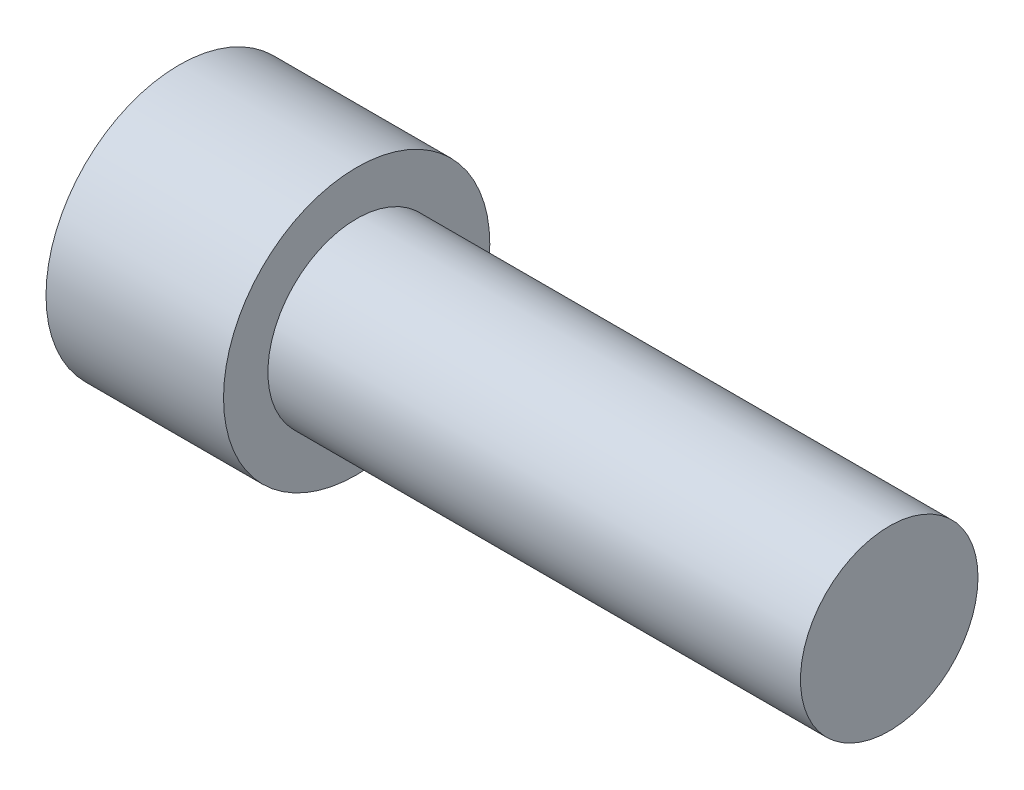
ISO-10303-21;
HEADER;
FILE_DESCRIPTION(('STEP AP214'),'2;1');
FILE_NAME('part.step','',(''),(''),'','','');
FILE_SCHEMA(('AUTOMOTIVE_DESIGN { 1 0 10303 214 1 1 1 1 }'));
ENDSEC;
DATA;
#1=APPLICATION_CONTEXT('core data for automotive mechanical design processes');
#2=APPLICATION_PROTOCOL_DEFINITION('international standard','automotive_design',2000,#1);
#3=PRODUCT_CONTEXT('',#1,'mechanical');
#4=PRODUCT('Part','Part','',(#3));
#5=PRODUCT_RELATED_PRODUCT_CATEGORY('part','',(#4));
#6=PRODUCT_DEFINITION_FORMATION('','',#4);
#7=PRODUCT_DEFINITION_CONTEXT('part definition',#1,'design');
#8=PRODUCT_DEFINITION('design','',#6,#7);
#9=PRODUCT_DEFINITION_SHAPE('','',#8);
#10=(LENGTH_UNIT() NAMED_UNIT(*) SI_UNIT(.MILLI.,.METRE.));
#11=(NAMED_UNIT(*) PLANE_ANGLE_UNIT() SI_UNIT($,.RADIAN.));
#12=(NAMED_UNIT(*) SI_UNIT($,.STERADIAN.) SOLID_ANGLE_UNIT());
#13=UNCERTAINTY_MEASURE_WITH_UNIT(LENGTH_MEASURE(1.E-05),#10,'distance_accuracy_value','');
#14=(GEOMETRIC_REPRESENTATION_CONTEXT(3) GLOBAL_UNCERTAINTY_ASSIGNED_CONTEXT((#13)) GLOBAL_UNIT_ASSIGNED_CONTEXT((#10,
#11,#12)) REPRESENTATION_CONTEXT('',''));
#15=CARTESIAN_POINT('',(0.,0.,0.));
#16=DIRECTION('',(0.,0.,1.));
#17=DIRECTION('',(1.,0.,0.));
#18=AXIS2_PLACEMENT_3D('',#15,#16,#17);
#19=CARTESIAN_POINT('',(19.0500000000004,0.,2.84494650060196E-13));
#20=DIRECTION('',(-1.00000000000001,0.,0.));
#21=DIRECTION('',(0.,0.,0.999999999999999));
#22=AXIS2_PLACEMENT_3D('',#19,#20,#21);
#23=CYLINDRICAL_SURFACE('',#22,3.175);
#24=CARTESIAN_POINT('',(19.0500000000004,0.,2.84494650060196E-13));
#25=DIRECTION('',(1.00000000000001,0.,0.));
#26=DIRECTION('',(0.,0.,-0.999999999999999));
#27=AXIS2_PLACEMENT_3D('',#24,#25,#26);
#28=CIRCLE('',#27,3.175);
#29=CARTESIAN_POINT('',(19.0500000000004,0.,-3.17499999999971));
#30=VERTEX_POINT('',#29);
#31=EDGE_CURVE('E11',#30,#30,#28,.T.);
#32=ORIENTED_EDGE('',*,*,#31,.F.);
#33=EDGE_LOOP('',(#32));
#34=FACE_BOUND('',#33,.T.);
#35=CARTESIAN_POINT('',(0.,0.,0.));
#36=DIRECTION('',(1.00000000000001,0.,0.));
#37=DIRECTION('',(0.,0.,-0.999999999999999));
#38=AXIS2_PLACEMENT_3D('',#35,#36,#37);
#39=CIRCLE('',#38,3.175);
#40=CARTESIAN_POINT('',(0.,1.02694885863559E-13,-3.175));
#41=VERTEX_POINT('',#40);
#42=EDGE_CURVE('E37',#41,#41,#39,.T.);
#43=ORIENTED_EDGE('',*,*,#42,.T.);
#44=EDGE_LOOP('',(#43));
#45=FACE_BOUND('',#44,.T.);
#46=ADVANCED_FACE('F34',(#34,#45),#23,.T.);
#47=CARTESIAN_POINT('',(19.0500000000004,0.,2.84494650060196E-13));
#48=DIRECTION('',(1.00000000000001,0.,0.));
#49=DIRECTION('',(0.,0.,-0.999999999999999));
#50=AXIS2_PLACEMENT_3D('',#47,#48,#49);
#51=PLANE('',#50);
#52=ORIENTED_EDGE('',*,*,#31,.T.);
#53=EDGE_LOOP('',(#52));
#54=FACE_BOUND('',#53,.T.);
#55=ADVANCED_FACE('F166',(#54),#51,.T.);
#56=CARTESIAN_POINT('',(-6.35000000000024,0.,0.));
#57=DIRECTION('',(1.00000000000001,0.,0.));
#58=DIRECTION('',(0.,0.,-0.999999999999999));
#59=AXIS2_PLACEMENT_3D('',#56,#57,#58);
#60=CYLINDRICAL_SURFACE('',#59,4.7625);
#61=CARTESIAN_POINT('',(-6.35000000000024,0.,0.));
#62=DIRECTION('',(-1.00000000000001,0.,0.));
#63=DIRECTION('',(0.,0.,0.999999999999999));
#64=AXIS2_PLACEMENT_3D('',#61,#62,#63);
#65=CIRCLE('',#64,4.7625);
#66=CARTESIAN_POINT('',(-6.3500000000002,-2.23431267834411E-13,4.76250000000002));
#67=VERTEX_POINT('',#66);
#68=EDGE_CURVE('E141',#67,#67,#65,.T.);
#69=ORIENTED_EDGE('',*,*,#68,.F.);
#70=EDGE_LOOP('',(#69));
#71=FACE_BOUND('',#70,.T.);
#72=CARTESIAN_POINT('',(0.,0.,0.));
#73=DIRECTION('',(-1.00000000000001,0.,0.));
#74=DIRECTION('',(0.,0.,0.999999999999999));
#75=AXIS2_PLACEMENT_3D('',#72,#73,#74);
#76=CIRCLE('',#75,4.7625);
#77=CARTESIAN_POINT('',(0.,-1.54042328795339E-13,4.76249999999999));
#78=VERTEX_POINT('',#77);
#79=EDGE_CURVE('E135',#78,#78,#76,.T.);
#80=ORIENTED_EDGE('',*,*,#79,.T.);
#81=EDGE_LOOP('',(#80));
#82=FACE_BOUND('',#81,.T.);
#83=ADVANCED_FACE('F147',(#71,#82),#60,.T.);
#84=CARTESIAN_POINT('',(-6.35000000000024,0.,0.));
#85=DIRECTION('',(-1.00000000000001,0.,0.));
#86=DIRECTION('',(0.,0.,0.999999999999999));
#87=AXIS2_PLACEMENT_3D('',#84,#85,#86);
#88=PLANE('',#87);
#89=DIRECTION('',(0.,0.499999999999968,0.866025403784426));
#90=VECTOR('',#89,1.);
#91=CARTESIAN_POINT('',(-6.35000000000002,-2.74963065701556,0.));
#92=LINE('',#91,#90);
#93=CARTESIAN_POINT('',(-6.35000000000002,-2.74963065701556,0.));
#94=VERTEX_POINT('',#93);
#95=CARTESIAN_POINT('',(-6.34999999999994,-1.37481532850786,2.38125000000001));
#96=VERTEX_POINT('',#95);
#97=EDGE_CURVE('E48',#94,#96,#92,.T.);
#98=ORIENTED_EDGE('',*,*,#97,.F.);
#99=DIRECTION('',(0.,-0.500000000000021,0.866025403784447));
#100=VECTOR('',#99,1.);
#101=CARTESIAN_POINT('',(-6.35000000000002,-1.37481532850781,-2.38125));
#102=LINE('',#101,#100);
#103=CARTESIAN_POINT('',(-6.35000000000002,-1.37481532850781,-2.38125));
#104=VERTEX_POINT('',#103);
#105=EDGE_CURVE('E131',#104,#94,#102,.T.);
#106=ORIENTED_EDGE('',*,*,#105,.F.);
#107=DIRECTION('',(0.,-0.999999999999991,0.));
#108=VECTOR('',#107,1.);
#109=CARTESIAN_POINT('',(-6.35000000000022,1.3748153285078,-2.38125000000008));
#110=LINE('',#109,#108);
#111=CARTESIAN_POINT('',(-6.35000000000022,1.3748153285078,-2.38125000000008));
#112=VERTEX_POINT('',#111);
#113=EDGE_CURVE('E129',#112,#104,#110,.T.);
#114=ORIENTED_EDGE('',*,*,#113,.F.);
#115=DIRECTION('',(0.,-0.499999999999968,-0.866025403784426));
#116=VECTOR('',#115,1.);
#117=CARTESIAN_POINT('',(-6.35000000000013,2.7496306570155,0.));
#118=LINE('',#117,#116);
#119=CARTESIAN_POINT('',(-6.35000000000013,2.7496306570155,0.));
#120=VERTEX_POINT('',#119);
#121=EDGE_CURVE('E96',#120,#112,#118,.T.);
#122=ORIENTED_EDGE('',*,*,#121,.F.);
#123=DIRECTION('',(0.,0.500000000000021,-0.866025403784447));
#124=VECTOR('',#123,1.);
#125=CARTESIAN_POINT('',(-6.35000000000019,1.37481532850766,2.38124999999996));
#126=LINE('',#125,#124);
#127=CARTESIAN_POINT('',(-6.35000000000019,1.37481532850766,2.38124999999996));
#128=VERTEX_POINT('',#127);
#129=EDGE_CURVE('E125',#128,#120,#126,.T.);
#130=ORIENTED_EDGE('',*,*,#129,.F.);
#131=DIRECTION('',(0.,0.999999999999991,0.));
#132=VECTOR('',#131,1.);
#133=CARTESIAN_POINT('',(-6.34999999999994,-1.37481532850786,2.38125000000001));
#134=LINE('',#133,#132);
#135=EDGE_CURVE('E122',#96,#128,#134,.T.);
#136=ORIENTED_EDGE('',*,*,#135,.F.);
#137=EDGE_LOOP('',(#98,#106,#114,#122,#130,#136));
#138=FACE_BOUND('',#137,.T.);
#139=ORIENTED_EDGE('',*,*,#68,.T.);
#140=EDGE_LOOP('',(#139));
#141=FACE_BOUND('',#140,.T.);
#142=ADVANCED_FACE('F152',(#138,#141),#88,.T.);
#143=CARTESIAN_POINT('',(0.,0.,0.));
#144=DIRECTION('',(-1.00000000000001,0.,0.));
#145=DIRECTION('',(0.,0.,0.999999999999999));
#146=AXIS2_PLACEMENT_3D('',#143,#144,#145);
#147=PLANE('',#146);
#148=ORIENTED_EDGE('',*,*,#42,.F.);
#149=EDGE_LOOP('',(#148));
#150=FACE_BOUND('',#149,.T.);
#151=ORIENTED_EDGE('',*,*,#79,.F.);
#152=EDGE_LOOP('',(#151));
#153=FACE_BOUND('',#152,.T.);
#154=ADVANCED_FACE('F149',(#150,#153),#147,.F.);
#155=CARTESIAN_POINT('',(-2.34999999999996,-2.74963065701561,1.23165366794353E-13));
#156=DIRECTION('',(0.,-0.866025403784449,0.50000000000002));
#157=DIRECTION('',(0.,-0.499999999999968,-0.866025403784426));
#158=AXIS2_PLACEMENT_3D('',#155,#156,#157);
#159=PLANE('',#158);
#160=ORIENTED_EDGE('',*,*,#97,.T.);
#161=DIRECTION('',(-1.00000000000001,0.,0.));
#162=VECTOR('',#161,1.);
#163=CARTESIAN_POINT('',(-2.34999999999985,-1.37481532850797,2.38125000000001));
#164=LINE('',#163,#162);
#165=CARTESIAN_POINT('',(-2.34999999999985,-1.37481532850797,2.38125000000001));
#166=VERTEX_POINT('',#165);
#167=EDGE_CURVE('E78',#166,#96,#164,.T.);
#168=ORIENTED_EDGE('',*,*,#167,.F.);
#169=DIRECTION('',(0.,0.499999999999968,0.866025403784426));
#170=VECTOR('',#169,1.);
#171=CARTESIAN_POINT('',(-2.34999999999996,-2.74963065701561,1.23165366794353E-13));
#172=LINE('',#171,#170);
#173=CARTESIAN_POINT('',(-2.34999999999996,-2.74963065701561,1.23165366794353E-13));
#174=VERTEX_POINT('',#173);
#175=EDGE_CURVE('E133',#174,#166,#172,.T.);
#176=ORIENTED_EDGE('',*,*,#175,.F.);
#177=DIRECTION('',(-1.00000000000001,0.,0.));
#178=VECTOR('',#177,1.);
#179=CARTESIAN_POINT('',(-2.34999999999996,-2.74963065701561,1.23165366794353E-13));
#180=LINE('',#179,#178);
#181=EDGE_CURVE('E56',#174,#94,#180,.T.);
#182=ORIENTED_EDGE('',*,*,#181,.T.);
#183=EDGE_LOOP('',(#160,#168,#176,#182));
#184=FACE_BOUND('',#183,.T.);
#185=ADVANCED_FACE('F151',(#184),#159,.F.);
#186=CARTESIAN_POINT('',(-2.34999999999999,-1.37481532850774,-2.38124999999999));
#187=DIRECTION('',(0.,-0.866025403784412,-0.499999999999978));
#188=DIRECTION('',(0.,0.500000000000021,-0.866025403784447));
#189=AXIS2_PLACEMENT_3D('',#186,#187,#188);
#190=PLANE('',#189);
#191=ORIENTED_EDGE('',*,*,#105,.T.);
#192=ORIENTED_EDGE('',*,*,#181,.F.);
#193=DIRECTION('',(0.,-0.500000000000021,0.866025403784447));
#194=VECTOR('',#193,1.);
#195=CARTESIAN_POINT('',(-2.34999999999999,-1.37481532850774,-2.38124999999999));
#196=LINE('',#195,#194);
#197=CARTESIAN_POINT('',(-2.34999999999999,-1.37481532850774,-2.38124999999999));
#198=VERTEX_POINT('',#197);
#199=EDGE_CURVE('E108',#198,#174,#196,.T.);
#200=ORIENTED_EDGE('',*,*,#199,.F.);
#201=DIRECTION('',(-1.00000000000001,0.,0.));
#202=VECTOR('',#201,1.);
#203=CARTESIAN_POINT('',(-2.34999999999999,-1.37481532850774,-2.38124999999999));
#204=LINE('',#203,#202);
#205=EDGE_CURVE('E100',#198,#104,#204,.T.);
#206=ORIENTED_EDGE('',*,*,#205,.T.);
#207=EDGE_LOOP('',(#191,#192,#200,#206));
#208=FACE_BOUND('',#207,.T.);
#209=ADVANCED_FACE('F159',(#208),#190,.F.);
#210=CARTESIAN_POINT('',(-2.35000000000024,1.37481532850778,-2.38125000000003));
#211=DIRECTION('',(0.,0.,-0.999999999999999));
#212=DIRECTION('',(0.,0.999999999999991,0.));
#213=AXIS2_PLACEMENT_3D('',#210,#211,#212);
#214=PLANE('',#213);
#215=ORIENTED_EDGE('',*,*,#113,.T.);
#216=ORIENTED_EDGE('',*,*,#205,.F.);
#217=DIRECTION('',(0.,-0.999999999999991,0.));
#218=VECTOR('',#217,1.);
#219=CARTESIAN_POINT('',(-2.35000000000024,1.37481532850778,-2.38125000000003));
#220=LINE('',#219,#218);
#221=CARTESIAN_POINT('',(-2.35000000000024,1.37481532850778,-2.38125000000003));
#222=VERTEX_POINT('',#221);
#223=EDGE_CURVE('E104',#222,#198,#220,.T.);
#224=ORIENTED_EDGE('',*,*,#223,.F.);
#225=DIRECTION('',(-1.00000000000001,0.,0.));
#226=VECTOR('',#225,1.);
#227=CARTESIAN_POINT('',(-2.35000000000024,1.37481532850778,-2.38125000000003));
#228=LINE('',#227,#226);
#229=EDGE_CURVE('E89',#222,#112,#228,.T.);
#230=ORIENTED_EDGE('',*,*,#229,.T.);
#231=EDGE_LOOP('',(#215,#216,#224,#230));
#232=FACE_BOUND('',#231,.T.);
#233=ADVANCED_FACE('F105',(#232),#214,.F.);
#234=CARTESIAN_POINT('',(-2.35000000000003,2.74963065701553,0.));
#235=DIRECTION('',(0.,0.866025403784449,-0.50000000000002));
#236=DIRECTION('',(0.,0.499999999999968,0.866025403784426));
#237=AXIS2_PLACEMENT_3D('',#234,#235,#236);
#238=PLANE('',#237);
#239=ORIENTED_EDGE('',*,*,#121,.T.);
#240=ORIENTED_EDGE('',*,*,#229,.F.);
#241=DIRECTION('',(0.,-0.499999999999968,-0.866025403784426));
#242=VECTOR('',#241,1.);
#243=CARTESIAN_POINT('',(-2.35000000000003,2.74963065701553,0.));
#244=LINE('',#243,#242);
#245=CARTESIAN_POINT('',(-2.35000000000003,2.74963065701553,0.));
#246=VERTEX_POINT('',#245);
#247=EDGE_CURVE('E93',#246,#222,#244,.T.);
#248=ORIENTED_EDGE('',*,*,#247,.F.);
#249=DIRECTION('',(-1.00000000000001,0.,0.));
#250=VECTOR('',#249,1.);
#251=CARTESIAN_POINT('',(-2.35000000000003,2.74963065701553,0.));
#252=LINE('',#251,#250);
#253=EDGE_CURVE('E101',#246,#120,#252,.T.);
#254=ORIENTED_EDGE('',*,*,#253,.T.);
#255=EDGE_LOOP('',(#239,#240,#248,#254));
#256=FACE_BOUND('',#255,.T.);
#257=ADVANCED_FACE('F91',(#256),#238,.F.);
#258=CARTESIAN_POINT('',(-2.35000000000005,1.37481532850754,2.38125));
#259=DIRECTION('',(0.,0.866025403784412,0.499999999999978));
#260=DIRECTION('',(0.,-0.500000000000021,0.866025403784447));
#261=AXIS2_PLACEMENT_3D('',#258,#259,#260);
#262=PLANE('',#261);
#263=ORIENTED_EDGE('',*,*,#129,.T.);
#264=ORIENTED_EDGE('',*,*,#253,.F.);
#265=DIRECTION('',(0.,0.500000000000021,-0.866025403784447));
#266=VECTOR('',#265,1.);
#267=CARTESIAN_POINT('',(-2.35000000000005,1.37481532850754,2.38125));
#268=LINE('',#267,#266);
#269=CARTESIAN_POINT('',(-2.35000000000005,1.37481532850754,2.38125));
#270=VERTEX_POINT('',#269);
#271=EDGE_CURVE('E114',#270,#246,#268,.T.);
#272=ORIENTED_EDGE('',*,*,#271,.F.);
#273=DIRECTION('',(-1.00000000000001,0.,0.));
#274=VECTOR('',#273,1.);
#275=CARTESIAN_POINT('',(-2.35000000000005,1.37481532850754,2.38125));
#276=LINE('',#275,#274);
#277=EDGE_CURVE('E138',#270,#128,#276,.T.);
#278=ORIENTED_EDGE('',*,*,#277,.T.);
#279=EDGE_LOOP('',(#263,#264,#272,#278));
#280=FACE_BOUND('',#279,.T.);
#281=ADVANCED_FACE('F212',(#280),#262,.F.);
#282=CARTESIAN_POINT('',(-2.34999999999985,-1.37481532850797,2.38125000000001));
#283=DIRECTION('',(0.,0.,0.999999999999999));
#284=DIRECTION('',(1.00000000000001,0.,0.));
#285=AXIS2_PLACEMENT_3D('',#282,#283,#284);
#286=PLANE('',#285);
#287=ORIENTED_EDGE('',*,*,#135,.T.);
#288=ORIENTED_EDGE('',*,*,#277,.F.);
#289=DIRECTION('',(0.,0.999999999999991,0.));
#290=VECTOR('',#289,1.);
#291=CARTESIAN_POINT('',(-2.34999999999985,-1.37481532850797,2.38125000000001));
#292=LINE('',#291,#290);
#293=EDGE_CURVE('E116',#166,#270,#292,.T.);
#294=ORIENTED_EDGE('',*,*,#293,.F.);
#295=ORIENTED_EDGE('',*,*,#167,.T.);
#296=EDGE_LOOP('',(#287,#288,#294,#295));
#297=FACE_BOUND('',#296,.T.);
#298=ADVANCED_FACE('F219',(#297),#286,.F.);
#299=CARTESIAN_POINT('',(-2.34999999999999,0.,0.));
#300=DIRECTION('',(-1.00000000000001,0.,0.));
#301=DIRECTION('',(0.,0.,0.999999999999999));
#302=AXIS2_PLACEMENT_3D('',#299,#300,#301);
#303=PLANE('',#302);
#304=ORIENTED_EDGE('',*,*,#175,.T.);
#305=ORIENTED_EDGE('',*,*,#293,.T.);
#306=ORIENTED_EDGE('',*,*,#271,.T.);
#307=ORIENTED_EDGE('',*,*,#247,.T.);
#308=ORIENTED_EDGE('',*,*,#223,.T.);
#309=ORIENTED_EDGE('',*,*,#199,.T.);
#310=EDGE_LOOP('',(#304,#305,#306,#307,#308,#309));
#311=FACE_BOUND('',#310,.T.);
#312=ADVANCED_FACE('F111',(#311),#303,.T.);
#313=CLOSED_SHELL('',(#46,#55,#83,#142,#154,#185,#209,#233,#257,#281,#298,#312));
#314=MANIFOLD_SOLID_BREP('B2',#313);
#315=ADVANCED_BREP_SHAPE_REPRESENTATION('',(#18,#314),#14);
#316=SHAPE_DEFINITION_REPRESENTATION(#9,#315);
ENDSEC;
END-ISO-10303-21;
